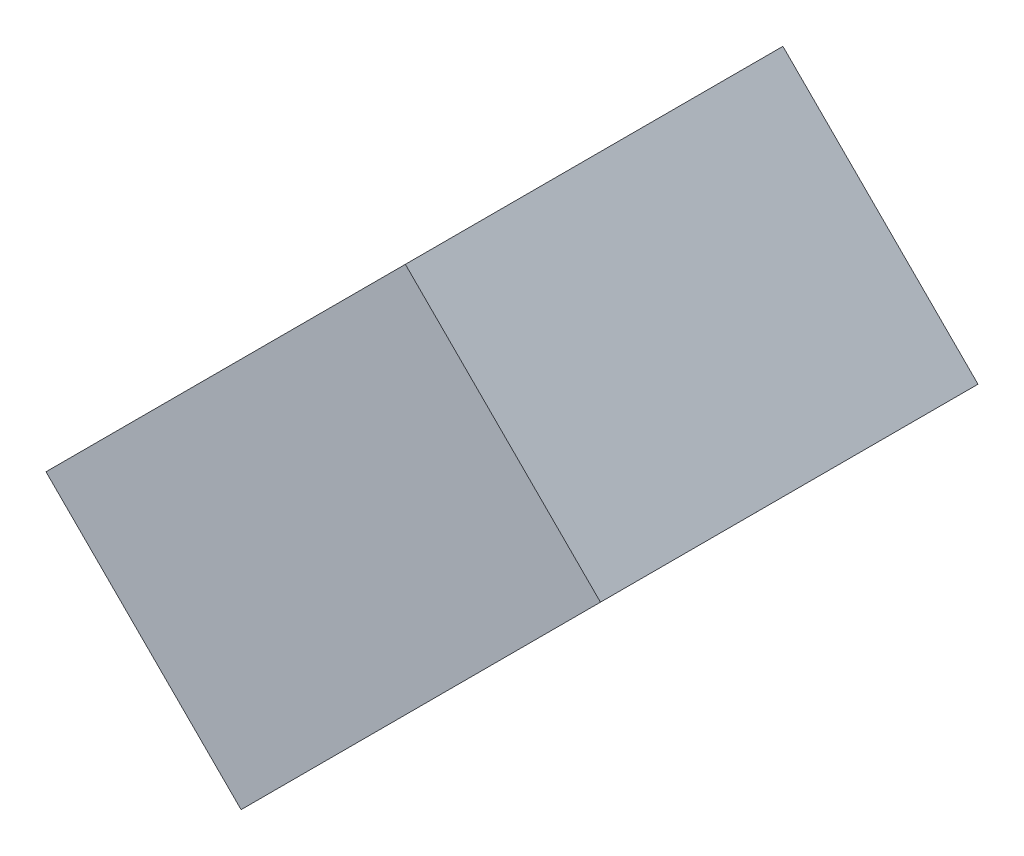
ISO-10303-21;
HEADER;
FILE_DESCRIPTION(('STEP AP214'),'2;1');
FILE_NAME('part.step','',(''),(''),'','','');
FILE_SCHEMA(('AUTOMOTIVE_DESIGN { 1 0 10303 214 1 1 1 1 }'));
ENDSEC;
DATA;
#1=APPLICATION_CONTEXT('core data for automotive mechanical design processes');
#2=APPLICATION_PROTOCOL_DEFINITION('international standard','automotive_design',2000,#1);
#3=PRODUCT_CONTEXT('',#1,'mechanical');
#4=PRODUCT('Part','Part','',(#3));
#5=PRODUCT_RELATED_PRODUCT_CATEGORY('part','',(#4));
#6=PRODUCT_DEFINITION_FORMATION('','',#4);
#7=PRODUCT_DEFINITION_CONTEXT('part definition',#1,'design');
#8=PRODUCT_DEFINITION('design','',#6,#7);
#9=PRODUCT_DEFINITION_SHAPE('','',#8);
#10=(LENGTH_UNIT() NAMED_UNIT(*) SI_UNIT(.MILLI.,.METRE.));
#11=(NAMED_UNIT(*) PLANE_ANGLE_UNIT() SI_UNIT($,.RADIAN.));
#12=(NAMED_UNIT(*) SI_UNIT($,.STERADIAN.) SOLID_ANGLE_UNIT());
#13=UNCERTAINTY_MEASURE_WITH_UNIT(LENGTH_MEASURE(1.E-05),#10,'distance_accuracy_value','');
#14=(GEOMETRIC_REPRESENTATION_CONTEXT(3) GLOBAL_UNCERTAINTY_ASSIGNED_CONTEXT((#13)) GLOBAL_UNIT_ASSIGNED_CONTEXT((#10,
#11,#12)) REPRESENTATION_CONTEXT('',''));
#15=CARTESIAN_POINT('',(0.,0.,0.));
#16=DIRECTION('',(0.,0.,1.));
#17=DIRECTION('',(1.,0.,0.));
#18=AXIS2_PLACEMENT_3D('',#15,#16,#17);
#19=CARTESIAN_POINT('',(-0.28283916,-0.95459296,0.));
#20=DIRECTION('',(-0.707107506902675,0.707106055469675,0.));
#21=DIRECTION('',(-0.707106055469675,-0.707107506902675,0.));
#22=AXIS2_PLACEMENT_3D('',#19,#20,#21);
#23=PLANE('',#22);
#24=DIRECTION('',(0.,0.,1.));
#25=VECTOR('',#24,1.);
#26=CARTESIAN_POINT('',(0.95459296,0.2828417,0.));
#27=LINE('',#26,#25);
#28=CARTESIAN_POINT('',(0.954592959999924,0.282841700000077,0.));
#29=VERTEX_POINT('',#28);
#30=CARTESIAN_POINT('',(0.954592959999924,0.282841700000077,1.29999994));
#31=VERTEX_POINT('',#30);
#32=EDGE_CURVE('E20',#29,#31,#27,.T.);
#33=ORIENTED_EDGE('',*,*,#32,.T.);
#34=DIRECTION('',(-0.70710605546985,-0.7071075069025,0.));
#35=VECTOR('',#34,1.);
#36=CARTESIAN_POINT('',(0.95459296,0.2828417,1.29999994));
#37=LINE('',#36,#35);
#38=CARTESIAN_POINT('',(-0.282839159999986,-0.954592959999986,1.29999994));
#39=VERTEX_POINT('',#38);
#40=EDGE_CURVE('E55',#31,#39,#37,.T.);
#41=ORIENTED_EDGE('',*,*,#40,.T.);
#42=DIRECTION('',(0.,0.,1.));
#43=VECTOR('',#42,1.);
#44=CARTESIAN_POINT('',(-0.282839159999943,-0.954592959999943,0.));
#45=LINE('',#44,#43);
#46=CARTESIAN_POINT('',(-0.282839159999972,-0.954592959999972,0.));
#47=VERTEX_POINT('',#46);
#48=EDGE_CURVE('E76',#39,#47,#45,.F.);
#49=ORIENTED_EDGE('',*,*,#48,.T.);
#50=DIRECTION('',(-0.70710605546985,-0.7071075069025,0.));
#51=VECTOR('',#50,1.);
#52=CARTESIAN_POINT('',(0.95459296,0.2828417,0.));
#53=LINE('',#52,#51);
#54=EDGE_CURVE('E58',#29,#47,#53,.T.);
#55=ORIENTED_EDGE('',*,*,#54,.F.);
#56=EDGE_LOOP('',(#33,#41,#49,#55));
#57=FACE_BOUND('',#56,.T.);
#58=ADVANCED_FACE('F17',(#57),#23,.F.);
#59=CARTESIAN_POINT('',(0.95459296,0.2828417,0.));
#60=DIRECTION('',(-0.707106781186548,-0.707106781186548,0.));
#61=DIRECTION('',(0.707106781186548,-0.707106781186548,0.));
#62=AXIS2_PLACEMENT_3D('',#59,#60,#61);
#63=PLANE('',#62);
#64=DIRECTION('',(0.,0.,1.));
#65=VECTOR('',#64,1.);
#66=CARTESIAN_POINT('',(0.2828417,0.95459296,0.));
#67=LINE('',#66,#65);
#68=CARTESIAN_POINT('',(0.2828417,0.95459296,0.));
#69=VERTEX_POINT('',#68);
#70=CARTESIAN_POINT('',(0.2828417,0.95459296,1.29999994));
#71=VERTEX_POINT('',#70);
#72=EDGE_CURVE('E73',#69,#71,#67,.T.);
#73=ORIENTED_EDGE('',*,*,#72,.T.);
#74=DIRECTION('',(0.707106781186548,-0.707106781186548,0.));
#75=VECTOR('',#74,1.);
#76=CARTESIAN_POINT('',(0.2828417,0.95459296,1.29999994));
#77=LINE('',#76,#75);
#78=EDGE_CURVE('E63',#71,#31,#77,.T.);
#79=ORIENTED_EDGE('',*,*,#78,.T.);
#80=ORIENTED_EDGE('',*,*,#32,.F.);
#81=DIRECTION('',(0.707106781186548,-0.707106781186548,0.));
#82=VECTOR('',#81,1.);
#83=CARTESIAN_POINT('',(0.2828417,0.95459296,0.));
#84=LINE('',#83,#82);
#85=EDGE_CURVE('E79',#69,#29,#84,.T.);
#86=ORIENTED_EDGE('',*,*,#85,.F.);
#87=EDGE_LOOP('',(#73,#79,#80,#86));
#88=FACE_BOUND('',#87,.T.);
#89=ADVANCED_FACE('F72',(#88),#63,.F.);
#90=CARTESIAN_POINT('',(-0.28283916,-0.95459296,1.29999994));
#91=DIRECTION('',(0.,0.,-1.));
#92=DIRECTION('',(-1.,0.,0.));
#93=AXIS2_PLACEMENT_3D('',#90,#91,#92);
#94=PLANE('',#93);
#95=ORIENTED_EDGE('',*,*,#78,.F.);
#96=DIRECTION('',(0.707106781186548,0.707106781186548,0.));
#97=VECTOR('',#96,1.);
#98=CARTESIAN_POINT('',(0.2828417,0.95459296,1.29999994));
#99=LINE('',#98,#97);
#100=CARTESIAN_POINT('',(-0.95459296,-0.2828417,1.29999994));
#101=VERTEX_POINT('',#100);
#102=EDGE_CURVE('E83',#71,#101,#99,.F.);
#103=ORIENTED_EDGE('',*,*,#102,.T.);
#104=DIRECTION('',(-0.707108118025284,0.707105444345284,0.));
#105=VECTOR('',#104,1.);
#106=CARTESIAN_POINT('',(-0.95459296,-0.2828417,1.29999994));
#107=LINE('',#106,#105);
#108=EDGE_CURVE('E69',#101,#39,#107,.F.);
#109=ORIENTED_EDGE('',*,*,#108,.T.);
#110=ORIENTED_EDGE('',*,*,#40,.F.);
#111=EDGE_LOOP('',(#95,#103,#109,#110));
#112=FACE_BOUND('',#111,.T.);
#113=ADVANCED_FACE('F66',(#112),#94,.F.);
#114=CARTESIAN_POINT('',(-0.95459296,-0.2828417,0.));
#115=DIRECTION('',(0.707105444345284,0.707108118025284,0.));
#116=DIRECTION('',(-0.707108118025284,0.707105444345284,0.));
#117=AXIS2_PLACEMENT_3D('',#114,#115,#116);
#118=PLANE('',#117);
#119=ORIENTED_EDGE('',*,*,#48,.F.);
#120=ORIENTED_EDGE('',*,*,#108,.F.);
#121=DIRECTION('',(0.,0.,1.));
#122=VECTOR('',#121,1.);
#123=CARTESIAN_POINT('',(-0.95459296,-0.2828417,0.));
#124=LINE('',#123,#122);
#125=CARTESIAN_POINT('',(-0.95459296,-0.2828417,0.));
#126=VERTEX_POINT('',#125);
#127=EDGE_CURVE('E26',#101,#126,#124,.F.);
#128=ORIENTED_EDGE('',*,*,#127,.T.);
#129=DIRECTION('',(-0.707108118025224,0.707105444345344,0.));
#130=VECTOR('',#129,1.);
#131=CARTESIAN_POINT('',(-0.28283916,-0.95459296,0.));
#132=LINE('',#131,#130);
#133=EDGE_CURVE('E34',#47,#126,#132,.T.);
#134=ORIENTED_EDGE('',*,*,#133,.F.);
#135=EDGE_LOOP('',(#119,#120,#128,#134));
#136=FACE_BOUND('',#135,.T.);
#137=ADVANCED_FACE('F88',(#136),#118,.F.);
#138=CARTESIAN_POINT('',(-0.28283916,-0.95459296,0.));
#139=DIRECTION('',(0.,0.,-1.));
#140=DIRECTION('',(-1.,0.,0.));
#141=AXIS2_PLACEMENT_3D('',#138,#139,#140);
#142=PLANE('',#141);
#143=ORIENTED_EDGE('',*,*,#85,.T.);
#144=ORIENTED_EDGE('',*,*,#54,.T.);
#145=ORIENTED_EDGE('',*,*,#133,.T.);
#146=DIRECTION('',(0.707106781186548,0.707106781186548,0.));
#147=VECTOR('',#146,1.);
#148=CARTESIAN_POINT('',(0.2828417,0.95459296,0.));
#149=LINE('',#148,#147);
#150=EDGE_CURVE('E11',#126,#69,#149,.T.);
#151=ORIENTED_EDGE('',*,*,#150,.T.);
#152=EDGE_LOOP('',(#143,#144,#145,#151));
#153=FACE_BOUND('',#152,.T.);
#154=ADVANCED_FACE('F91',(#153),#142,.T.);
#155=CARTESIAN_POINT('',(0.2828417,0.95459296,0.));
#156=DIRECTION('',(0.707106781186548,-0.707106781186548,0.));
#157=DIRECTION('',(0.707106781186548,0.707106781186548,0.));
#158=AXIS2_PLACEMENT_3D('',#155,#156,#157);
#159=PLANE('',#158);
#160=ORIENTED_EDGE('',*,*,#127,.F.);
#161=ORIENTED_EDGE('',*,*,#102,.F.);
#162=ORIENTED_EDGE('',*,*,#72,.F.);
#163=ORIENTED_EDGE('',*,*,#150,.F.);
#164=EDGE_LOOP('',(#160,#161,#162,#163));
#165=FACE_BOUND('',#164,.T.);
#166=ADVANCED_FACE('F90',(#165),#159,.F.);
#167=CLOSED_SHELL('',(#58,#89,#113,#137,#154,#166));
#168=MANIFOLD_SOLID_BREP('B1',#167);
#169=ADVANCED_BREP_SHAPE_REPRESENTATION('',(#18,#168),#14);
#170=SHAPE_DEFINITION_REPRESENTATION(#9,#169);
ENDSEC;
END-ISO-10303-21;
